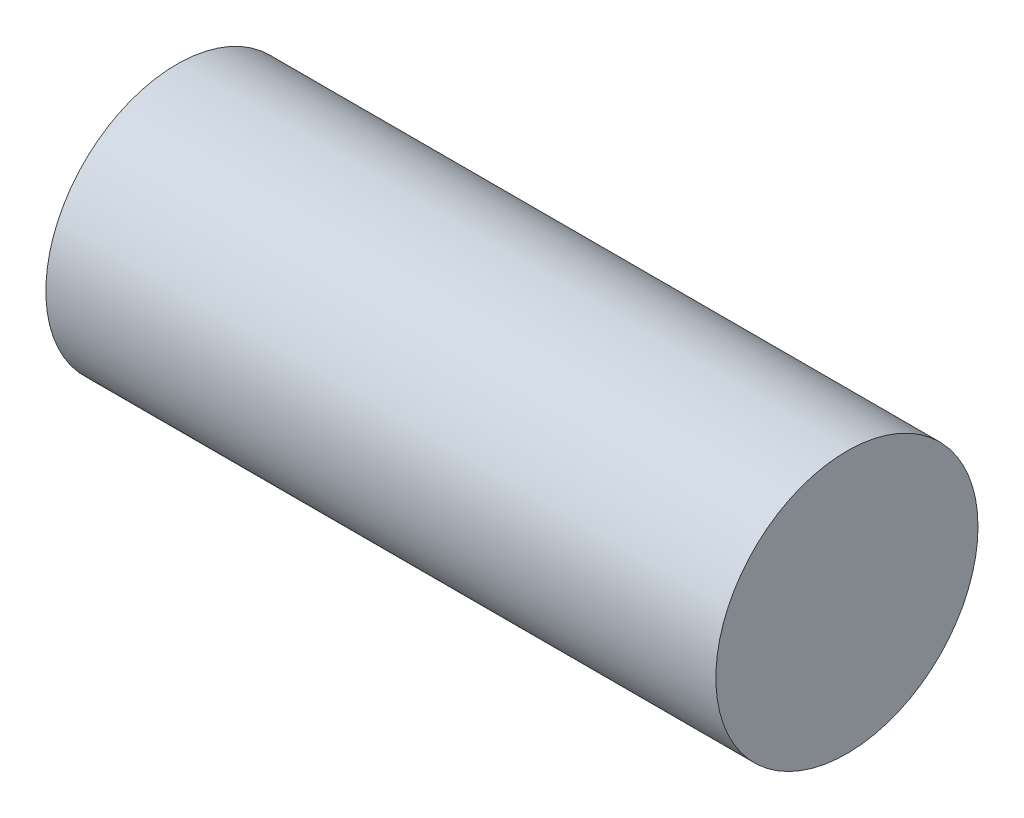
ISO-10303-21;
HEADER;
FILE_DESCRIPTION(('STEP AP214'),'2;1');
FILE_NAME('part.step','',(''),(''),'','','');
FILE_SCHEMA(('AUTOMOTIVE_DESIGN { 1 0 10303 214 1 1 1 1 }'));
ENDSEC;
DATA;
#1=APPLICATION_CONTEXT('core data for automotive mechanical design processes');
#2=APPLICATION_PROTOCOL_DEFINITION('international standard','automotive_design',2000,#1);
#3=PRODUCT_CONTEXT('',#1,'mechanical');
#4=PRODUCT('Part','Part','',(#3));
#5=PRODUCT_RELATED_PRODUCT_CATEGORY('part','',(#4));
#6=PRODUCT_DEFINITION_FORMATION('','',#4);
#7=PRODUCT_DEFINITION_CONTEXT('part definition',#1,'design');
#8=PRODUCT_DEFINITION('design','',#6,#7);
#9=PRODUCT_DEFINITION_SHAPE('','',#8);
#10=(LENGTH_UNIT() NAMED_UNIT(*) SI_UNIT(.MILLI.,.METRE.));
#11=(NAMED_UNIT(*) PLANE_ANGLE_UNIT() SI_UNIT($,.RADIAN.));
#12=(NAMED_UNIT(*) SI_UNIT($,.STERADIAN.) SOLID_ANGLE_UNIT());
#13=UNCERTAINTY_MEASURE_WITH_UNIT(LENGTH_MEASURE(1.E-05),#10,'distance_accuracy_value','');
#14=(GEOMETRIC_REPRESENTATION_CONTEXT(3) GLOBAL_UNCERTAINTY_ASSIGNED_CONTEXT((#13)) GLOBAL_UNIT_ASSIGNED_CONTEXT((#10,
#11,#12)) REPRESENTATION_CONTEXT('',''));
#15=CARTESIAN_POINT('',(0.,0.,0.));
#16=DIRECTION('',(0.,0.,1.));
#17=DIRECTION('',(1.,0.,0.));
#18=AXIS2_PLACEMENT_3D('',#15,#16,#17);
#19=CARTESIAN_POINT('',(40.,0.,0.));
#20=DIRECTION('',(-1.,0.,0.));
#21=DIRECTION('',(0.,0.,1.));
#22=AXIS2_PLACEMENT_3D('',#19,#20,#21);
#23=CYLINDRICAL_SURFACE('',#22,7.825);
#24=CARTESIAN_POINT('',(40.,0.,0.));
#25=DIRECTION('',(1.,0.,0.));
#26=DIRECTION('',(0.,0.,-1.));
#27=AXIS2_PLACEMENT_3D('',#24,#25,#26);
#28=CIRCLE('',#27,7.825);
#29=CARTESIAN_POINT('',(40.,0.,-7.825));
#30=VERTEX_POINT('',#29);
#31=EDGE_CURVE('E10',#30,#30,#28,.T.);
#32=ORIENTED_EDGE('',*,*,#31,.F.);
#33=EDGE_LOOP('',(#32));
#34=FACE_BOUND('',#33,.T.);
#35=CARTESIAN_POINT('',(0.,0.,0.));
#36=DIRECTION('',(1.,0.,0.));
#37=DIRECTION('',(0.,0.,-1.));
#38=AXIS2_PLACEMENT_3D('',#35,#36,#37);
#39=CIRCLE('',#38,7.825);
#40=CARTESIAN_POINT('',(0.,0.,-7.825));
#41=VERTEX_POINT('',#40);
#42=EDGE_CURVE('E40',#41,#41,#39,.T.);
#43=ORIENTED_EDGE('',*,*,#42,.T.);
#44=EDGE_LOOP('',(#43));
#45=FACE_BOUND('',#44,.T.);
#46=ADVANCED_FACE('F37',(#34,#45),#23,.T.);
#47=CARTESIAN_POINT('',(40.,0.,0.));
#48=DIRECTION('',(1.,0.,0.));
#49=DIRECTION('',(0.,0.,-1.));
#50=AXIS2_PLACEMENT_3D('',#47,#48,#49);
#51=PLANE('',#50);
#52=ORIENTED_EDGE('',*,*,#31,.T.);
#53=EDGE_LOOP('',(#52));
#54=FACE_BOUND('',#53,.T.);
#55=ADVANCED_FACE('F52',(#54),#51,.T.);
#56=CARTESIAN_POINT('',(0.,0.,0.));
#57=DIRECTION('',(1.,0.,0.));
#58=DIRECTION('',(0.,0.,-1.));
#59=AXIS2_PLACEMENT_3D('',#56,#57,#58);
#60=PLANE('',#59);
#61=ORIENTED_EDGE('',*,*,#42,.F.);
#62=EDGE_LOOP('',(#61));
#63=FACE_BOUND('',#62,.T.);
#64=ADVANCED_FACE('F50',(#63),#60,.F.);
#65=CLOSED_SHELL('',(#46,#55,#64));
#66=MANIFOLD_SOLID_BREP('B2',#65);
#67=ADVANCED_BREP_SHAPE_REPRESENTATION('',(#18,#66),#14);
#68=SHAPE_DEFINITION_REPRESENTATION(#9,#67);
ENDSEC;
END-ISO-10303-21;
